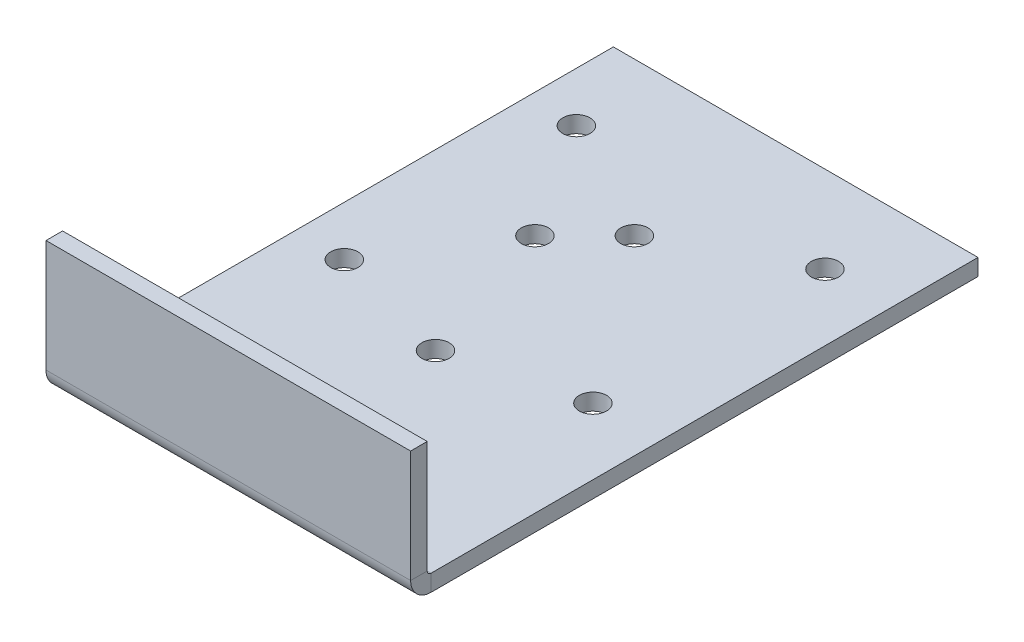
ISO-10303-21;
HEADER;
FILE_DESCRIPTION(('STEP AP214'),'2;1');
FILE_NAME('part.step','',(''),(''),'','','');
FILE_SCHEMA(('AUTOMOTIVE_DESIGN { 1 0 10303 214 1 1 1 1 }'));
ENDSEC;
DATA;
#1=APPLICATION_CONTEXT('core data for automotive mechanical design processes');
#2=APPLICATION_PROTOCOL_DEFINITION('international standard','automotive_design',2000,#1);
#3=PRODUCT_CONTEXT('',#1,'mechanical');
#4=PRODUCT('Part','Part','',(#3));
#5=PRODUCT_RELATED_PRODUCT_CATEGORY('part','',(#4));
#6=PRODUCT_DEFINITION_FORMATION('','',#4);
#7=PRODUCT_DEFINITION_CONTEXT('part definition',#1,'design');
#8=PRODUCT_DEFINITION('design','',#6,#7);
#9=PRODUCT_DEFINITION_SHAPE('','',#8);
#10=(LENGTH_UNIT() NAMED_UNIT(*) SI_UNIT(.MILLI.,.METRE.));
#11=(NAMED_UNIT(*) PLANE_ANGLE_UNIT() SI_UNIT($,.RADIAN.));
#12=(NAMED_UNIT(*) SI_UNIT($,.STERADIAN.) SOLID_ANGLE_UNIT());
#13=UNCERTAINTY_MEASURE_WITH_UNIT(LENGTH_MEASURE(1.E-05),#10,'distance_accuracy_value','');
#14=(GEOMETRIC_REPRESENTATION_CONTEXT(3) GLOBAL_UNCERTAINTY_ASSIGNED_CONTEXT((#13)) GLOBAL_UNIT_ASSIGNED_CONTEXT((#10,
#11,#12)) REPRESENTATION_CONTEXT('',''));
#15=CARTESIAN_POINT('',(0.,0.,0.));
#16=DIRECTION('',(0.,0.,1.));
#17=DIRECTION('',(1.,0.,0.));
#18=AXIS2_PLACEMENT_3D('',#15,#16,#17);
#19=CARTESIAN_POINT('',(0.,-3.175,0.));
#20=DIRECTION('',(-1.,0.,0.));
#21=DIRECTION('',(0.,0.,1.));
#22=AXIS2_PLACEMENT_3D('',#19,#20,#21);
#23=PLANE('',#22);
#24=DIRECTION('',(0.,0.,1.));
#25=VECTOR('',#24,1.);
#26=CARTESIAN_POINT('',(0.,0.,0.));
#27=LINE('',#26,#25);
#28=CARTESIAN_POINT('',(0.,0.,-101.6));
#29=VERTEX_POINT('',#28);
#30=CARTESIAN_POINT('',(0.,0.,3.175));
#31=VERTEX_POINT('',#30);
#32=EDGE_CURVE('E193',#29,#31,#27,.T.);
#33=ORIENTED_EDGE('',*,*,#32,.F.);
#34=DIRECTION('',(0.,1.,0.));
#35=VECTOR('',#34,1.);
#36=CARTESIAN_POINT('',(0.,-3.175,-101.6));
#37=LINE('',#36,#35);
#38=CARTESIAN_POINT('',(0.,-3.175,-101.6));
#39=VERTEX_POINT('',#38);
#40=EDGE_CURVE('E13',#39,#29,#37,.T.);
#41=ORIENTED_EDGE('',*,*,#40,.F.);
#42=DIRECTION('',(0.,0.,1.));
#43=VECTOR('',#42,1.);
#44=CARTESIAN_POINT('',(0.,-3.175,0.));
#45=LINE('',#44,#43);
#46=CARTESIAN_POINT('',(0.,-3.175,3.175));
#47=VERTEX_POINT('',#46);
#48=EDGE_CURVE('E196',#39,#47,#45,.T.);
#49=ORIENTED_EDGE('',*,*,#48,.T.);
#50=DIRECTION('',(0.,-1.,0.));
#51=VECTOR('',#50,1.);
#52=CARTESIAN_POINT('',(0.,0.,3.175));
#53=LINE('',#52,#51);
#54=EDGE_CURVE('E191',#31,#47,#53,.T.);
#55=ORIENTED_EDGE('',*,*,#54,.F.);
#56=EDGE_LOOP('',(#33,#41,#49,#55));
#57=FACE_BOUND('',#56,.T.);
#58=ADVANCED_FACE('F63',(#57),#23,.T.);
#59=CARTESIAN_POINT('',(0.,-3.175,-101.6));
#60=DIRECTION('',(0.,0.,-1.));
#61=DIRECTION('',(-1.,0.,0.));
#62=AXIS2_PLACEMENT_3D('',#59,#60,#61);
#63=PLANE('',#62);
#64=DIRECTION('',(-1.,0.,0.));
#65=VECTOR('',#64,1.);
#66=CARTESIAN_POINT('',(0.,0.,-101.6));
#67=LINE('',#66,#65);
#68=CARTESIAN_POINT('',(69.85,0.,-101.6));
#69=VERTEX_POINT('',#68);
#70=EDGE_CURVE('E199',#69,#29,#67,.T.);
#71=ORIENTED_EDGE('',*,*,#70,.F.);
#72=DIRECTION('',(0.,1.,0.));
#73=VECTOR('',#72,1.);
#74=CARTESIAN_POINT('',(69.85,-3.175,-101.6));
#75=LINE('',#74,#73);
#76=CARTESIAN_POINT('',(69.85,-3.175,-101.6));
#77=VERTEX_POINT('',#76);
#78=EDGE_CURVE('E72',#77,#69,#75,.T.);
#79=ORIENTED_EDGE('',*,*,#78,.F.);
#80=DIRECTION('',(-1.,0.,0.));
#81=VECTOR('',#80,1.);
#82=CARTESIAN_POINT('',(0.,-3.175,-101.6));
#83=LINE('',#82,#81);
#84=EDGE_CURVE('E201',#77,#39,#83,.T.);
#85=ORIENTED_EDGE('',*,*,#84,.T.);
#86=ORIENTED_EDGE('',*,*,#40,.T.);
#87=EDGE_LOOP('',(#71,#79,#85,#86));
#88=FACE_BOUND('',#87,.T.);
#89=ADVANCED_FACE('F276',(#88),#63,.T.);
#90=CARTESIAN_POINT('',(69.85,-3.175,0.));
#91=DIRECTION('',(1.,0.,0.));
#92=DIRECTION('',(0.,0.,-1.));
#93=AXIS2_PLACEMENT_3D('',#90,#91,#92);
#94=PLANE('',#93);
#95=DIRECTION('',(0.,0.,-1.));
#96=VECTOR('',#95,1.);
#97=CARTESIAN_POINT('',(69.85,0.,0.));
#98=LINE('',#97,#96);
#99=CARTESIAN_POINT('',(69.85,0.,3.175));
#100=VERTEX_POINT('',#99);
#101=EDGE_CURVE('E206',#100,#69,#98,.T.);
#102=ORIENTED_EDGE('',*,*,#101,.F.);
#103=DIRECTION('',(0.,-1.,0.));
#104=VECTOR('',#103,1.);
#105=CARTESIAN_POINT('',(69.85,0.,3.175));
#106=LINE('',#105,#104);
#107=CARTESIAN_POINT('',(69.85,-3.175,3.175));
#108=VERTEX_POINT('',#107);
#109=EDGE_CURVE('E180',#100,#108,#106,.T.);
#110=ORIENTED_EDGE('',*,*,#109,.T.);
#111=DIRECTION('',(0.,0.,-1.));
#112=VECTOR('',#111,1.);
#113=CARTESIAN_POINT('',(69.85,-3.175,0.));
#114=LINE('',#113,#112);
#115=EDGE_CURVE('E198',#108,#77,#114,.T.);
#116=ORIENTED_EDGE('',*,*,#115,.T.);
#117=ORIENTED_EDGE('',*,*,#78,.T.);
#118=EDGE_LOOP('',(#102,#110,#116,#117));
#119=FACE_BOUND('',#118,.T.);
#120=ADVANCED_FACE('F281',(#119),#94,.T.);
#121=CARTESIAN_POINT('',(0.,-3.175,0.));
#122=DIRECTION('',(0.,-1.,0.));
#123=DIRECTION('',(0.,0.,-1.));
#124=AXIS2_PLACEMENT_3D('',#121,#122,#123);
#125=PLANE('',#124);
#126=CARTESIAN_POINT('',(33.3375,-3.175,-34.1884));
#127=DIRECTION('',(0.,-1.,0.));
#128=DIRECTION('',(0.,0.,-1.));
#129=AXIS2_PLACEMENT_3D('',#126,#127,#128);
#130=CIRCLE('',#129,2.60985);
#131=CARTESIAN_POINT('',(33.3375,-3.175,-36.79825));
#132=VERTEX_POINT('',#131);
#133=EDGE_CURVE('E238',#132,#132,#130,.T.);
#134=ORIENTED_EDGE('',*,*,#133,.F.);
#135=EDGE_LOOP('',(#134));
#136=FACE_BOUND('',#135,.T.);
#137=CARTESIAN_POINT('',(23.8125,-3.175,-62.7634000000001));
#138=DIRECTION('',(0.,-1.,0.));
#139=DIRECTION('',(0.,0.,-1.));
#140=AXIS2_PLACEMENT_3D('',#137,#138,#139);
#141=CIRCLE('',#140,2.60985);
#142=CARTESIAN_POINT('',(23.8125,-3.175,-65.3732500000001));
#143=VERTEX_POINT('',#142);
#144=EDGE_CURVE('E228',#143,#143,#141,.T.);
#145=ORIENTED_EDGE('',*,*,#144,.F.);
#146=EDGE_LOOP('',(#145));
#147=FACE_BOUND('',#146,.T.);
#148=CARTESIAN_POINT('',(33.3375,-3.175,-72.2884));
#149=DIRECTION('',(0.,-1.,0.));
#150=DIRECTION('',(0.,0.,-1.));
#151=AXIS2_PLACEMENT_3D('',#148,#149,#150);
#152=CIRCLE('',#151,2.60985);
#153=CARTESIAN_POINT('',(33.3375,-3.175,-74.89825));
#154=VERTEX_POINT('',#153);
#155=EDGE_CURVE('E225',#154,#154,#152,.T.);
#156=ORIENTED_EDGE('',*,*,#155,.F.);
#157=EDGE_LOOP('',(#156));
#158=FACE_BOUND('',#157,.T.);
#159=CARTESIAN_POINT('',(57.15,-3.175,-84.9884));
#160=DIRECTION('',(0.,-1.,0.));
#161=DIRECTION('',(0.,0.,-1.));
#162=AXIS2_PLACEMENT_3D('',#159,#160,#161);
#163=CIRCLE('',#162,2.60985);
#164=CARTESIAN_POINT('',(57.15,-3.175,-87.59825));
#165=VERTEX_POINT('',#164);
#166=EDGE_CURVE('E222',#165,#165,#163,.T.);
#167=ORIENTED_EDGE('',*,*,#166,.F.);
#168=EDGE_LOOP('',(#167));
#169=FACE_BOUND('',#168,.T.);
#170=CARTESIAN_POINT('',(57.15,-3.175,-40.5384));
#171=DIRECTION('',(0.,-1.,0.));
#172=DIRECTION('',(0.,0.,-1.));
#173=AXIS2_PLACEMENT_3D('',#170,#171,#172);
#174=CIRCLE('',#173,2.60985);
#175=CARTESIAN_POINT('',(57.15,-3.175,-43.14825));
#176=VERTEX_POINT('',#175);
#177=EDGE_CURVE('E218',#176,#176,#174,.T.);
#178=ORIENTED_EDGE('',*,*,#177,.F.);
#179=EDGE_LOOP('',(#178));
#180=FACE_BOUND('',#179,.T.);
#181=CARTESIAN_POINT('',(9.52499999999999,-3.175,-40.5384000000001));
#182=DIRECTION('',(0.,-1.,0.));
#183=DIRECTION('',(0.,0.,-1.));
#184=AXIS2_PLACEMENT_3D('',#181,#182,#183);
#185=CIRCLE('',#184,2.60985);
#186=CARTESIAN_POINT('',(9.52499999999999,-3.175,-43.1482500000001));
#187=VERTEX_POINT('',#186);
#188=EDGE_CURVE('E217',#187,#187,#185,.T.);
#189=ORIENTED_EDGE('',*,*,#188,.F.);
#190=EDGE_LOOP('',(#189));
#191=FACE_BOUND('',#190,.T.);
#192=CARTESIAN_POINT('',(9.52499999999999,-3.175,-84.9884));
#193=DIRECTION('',(0.,-1.,0.));
#194=DIRECTION('',(0.,0.,-1.));
#195=AXIS2_PLACEMENT_3D('',#192,#193,#194);
#196=CIRCLE('',#195,2.60985);
#197=CARTESIAN_POINT('',(9.52499999999999,-3.175,-87.59825));
#198=VERTEX_POINT('',#197);
#199=EDGE_CURVE('E213',#198,#198,#196,.T.);
#200=ORIENTED_EDGE('',*,*,#199,.F.);
#201=EDGE_LOOP('',(#200));
#202=FACE_BOUND('',#201,.T.);
#203=ORIENTED_EDGE('',*,*,#48,.F.);
#204=ORIENTED_EDGE('',*,*,#84,.F.);
#205=ORIENTED_EDGE('',*,*,#115,.F.);
#206=DIRECTION('',(1.,0.,0.));
#207=VECTOR('',#206,1.);
#208=CARTESIAN_POINT('',(69.85,-3.175,3.175));
#209=LINE('',#208,#207);
#210=EDGE_CURVE('E175',#108,#47,#209,.F.);
#211=ORIENTED_EDGE('',*,*,#210,.T.);
#212=EDGE_LOOP('',(#203,#204,#205,#211));
#213=FACE_BOUND('',#212,.T.);
#214=ADVANCED_FACE('F292',(#136,#147,#158,#169,#180,#191,#202,#213),#125,.T.);
#215=CARTESIAN_POINT('',(0.,0.,0.));
#216=DIRECTION('',(0.,-1.,0.));
#217=DIRECTION('',(0.,0.,-1.));
#218=AXIS2_PLACEMENT_3D('',#215,#216,#217);
#219=PLANE('',#218);
#220=CARTESIAN_POINT('',(33.3375,0.,-34.1884));
#221=DIRECTION('',(0.,-1.,0.));
#222=DIRECTION('',(0.,0.,-1.));
#223=AXIS2_PLACEMENT_3D('',#220,#221,#222);
#224=CIRCLE('',#223,2.60985);
#225=CARTESIAN_POINT('',(33.3375,0.,-36.79825));
#226=VERTEX_POINT('',#225);
#227=EDGE_CURVE('E66',#226,#226,#224,.T.);
#228=ORIENTED_EDGE('',*,*,#227,.T.);
#229=EDGE_LOOP('',(#228));
#230=FACE_BOUND('',#229,.T.);
#231=CARTESIAN_POINT('',(23.8125,0.,-62.7634000000001));
#232=DIRECTION('',(0.,-1.,0.));
#233=DIRECTION('',(0.,0.,-1.));
#234=AXIS2_PLACEMENT_3D('',#231,#232,#233);
#235=CIRCLE('',#234,2.60985);
#236=CARTESIAN_POINT('',(23.8125,0.,-65.3732500000001));
#237=VERTEX_POINT('',#236);
#238=EDGE_CURVE('E226',#237,#237,#235,.T.);
#239=ORIENTED_EDGE('',*,*,#238,.T.);
#240=EDGE_LOOP('',(#239));
#241=FACE_BOUND('',#240,.T.);
#242=CARTESIAN_POINT('',(33.3375,0.,-72.2884));
#243=DIRECTION('',(0.,-1.,0.));
#244=DIRECTION('',(0.,0.,-1.));
#245=AXIS2_PLACEMENT_3D('',#242,#243,#244);
#246=CIRCLE('',#245,2.60985);
#247=CARTESIAN_POINT('',(33.3375,0.,-74.89825));
#248=VERTEX_POINT('',#247);
#249=EDGE_CURVE('E223',#248,#248,#246,.T.);
#250=ORIENTED_EDGE('',*,*,#249,.T.);
#251=EDGE_LOOP('',(#250));
#252=FACE_BOUND('',#251,.T.);
#253=CARTESIAN_POINT('',(57.15,0.,-84.9884));
#254=DIRECTION('',(0.,-1.,0.));
#255=DIRECTION('',(0.,0.,-1.));
#256=AXIS2_PLACEMENT_3D('',#253,#254,#255);
#257=CIRCLE('',#256,2.60985);
#258=CARTESIAN_POINT('',(57.15,0.,-87.59825));
#259=VERTEX_POINT('',#258);
#260=EDGE_CURVE('E219',#259,#259,#257,.T.);
#261=ORIENTED_EDGE('',*,*,#260,.T.);
#262=EDGE_LOOP('',(#261));
#263=FACE_BOUND('',#262,.T.);
#264=CARTESIAN_POINT('',(57.15,0.,-40.5384));
#265=DIRECTION('',(0.,-1.,0.));
#266=DIRECTION('',(0.,0.,-1.));
#267=AXIS2_PLACEMENT_3D('',#264,#265,#266);
#268=CIRCLE('',#267,2.60985);
#269=CARTESIAN_POINT('',(57.15,0.,-43.14825));
#270=VERTEX_POINT('',#269);
#271=EDGE_CURVE('E214',#270,#270,#268,.T.);
#272=ORIENTED_EDGE('',*,*,#271,.T.);
#273=EDGE_LOOP('',(#272));
#274=FACE_BOUND('',#273,.T.);
#275=CARTESIAN_POINT('',(9.52499999999999,0.,-40.5384000000001));
#276=DIRECTION('',(0.,-1.,0.));
#277=DIRECTION('',(0.,0.,-1.));
#278=AXIS2_PLACEMENT_3D('',#275,#276,#277);
#279=CIRCLE('',#278,2.60985);
#280=CARTESIAN_POINT('',(9.52499999999999,0.,-43.1482500000001));
#281=VERTEX_POINT('',#280);
#282=EDGE_CURVE('E247',#281,#281,#279,.T.);
#283=ORIENTED_EDGE('',*,*,#282,.T.);
#284=EDGE_LOOP('',(#283));
#285=FACE_BOUND('',#284,.T.);
#286=CARTESIAN_POINT('',(9.52499999999999,0.,-84.9884));
#287=DIRECTION('',(0.,-1.,0.));
#288=DIRECTION('',(0.,0.,-1.));
#289=AXIS2_PLACEMENT_3D('',#286,#287,#288);
#290=CIRCLE('',#289,2.60985);
#291=CARTESIAN_POINT('',(9.52499999999999,0.,-87.59825));
#292=VERTEX_POINT('',#291);
#293=EDGE_CURVE('E174',#292,#292,#290,.T.);
#294=ORIENTED_EDGE('',*,*,#293,.T.);
#295=EDGE_LOOP('',(#294));
#296=FACE_BOUND('',#295,.T.);
#297=ORIENTED_EDGE('',*,*,#32,.T.);
#298=DIRECTION('',(1.,0.,0.));
#299=VECTOR('',#298,1.);
#300=CARTESIAN_POINT('',(69.85,0.,3.175));
#301=LINE('',#300,#299);
#302=EDGE_CURVE('E186',#100,#31,#301,.F.);
#303=ORIENTED_EDGE('',*,*,#302,.F.);
#304=ORIENTED_EDGE('',*,*,#101,.T.);
#305=ORIENTED_EDGE('',*,*,#70,.T.);
#306=EDGE_LOOP('',(#297,#303,#304,#305));
#307=FACE_BOUND('',#306,.T.);
#308=ADVANCED_FACE('F288',(#230,#241,#252,#263,#274,#285,#296,#307),#219,.F.);
#309=CARTESIAN_POINT('',(0.,0.736599999999997,3.175));
#310=DIRECTION('',(-1.,0.,0.));
#311=DIRECTION('',(0.,0.,1.));
#312=AXIS2_PLACEMENT_3D('',#309,#310,#311);
#313=PLANE('',#312);
#314=DIRECTION('',(0.,0.,-1.));
#315=VECTOR('',#314,1.);
#316=CARTESIAN_POINT('',(0.,0.736599999999997,7.0866));
#317=LINE('',#316,#315);
#318=CARTESIAN_POINT('',(0.,0.736599999999997,3.9116));
#319=VERTEX_POINT('',#318);
#320=CARTESIAN_POINT('',(0.,0.736599999999997,7.0866));
#321=VERTEX_POINT('',#320);
#322=EDGE_CURVE('E156',#319,#321,#317,.F.);
#323=ORIENTED_EDGE('',*,*,#322,.F.);
#324=CARTESIAN_POINT('',(0.,0.736599999999997,3.175));
#325=DIRECTION('',(1.,0.,0.));
#326=DIRECTION('',(0.,0.,-1.));
#327=AXIS2_PLACEMENT_3D('',#324,#325,#326);
#328=CIRCLE('',#327,0.7366);
#329=EDGE_CURVE('E183',#31,#319,#328,.F.);
#330=ORIENTED_EDGE('',*,*,#329,.F.);
#331=ORIENTED_EDGE('',*,*,#54,.T.);
#332=CARTESIAN_POINT('',(0.,0.736599999999997,3.175));
#333=DIRECTION('',(1.,0.,0.));
#334=DIRECTION('',(0.,0.,-1.));
#335=AXIS2_PLACEMENT_3D('',#332,#333,#334);
#336=CIRCLE('',#335,3.9116);
#337=EDGE_CURVE('E97',#47,#321,#336,.F.);
#338=ORIENTED_EDGE('',*,*,#337,.T.);
#339=EDGE_LOOP('',(#323,#330,#331,#338));
#340=FACE_BOUND('',#339,.T.);
#341=ADVANCED_FACE('F294',(#340),#313,.T.);
#342=CARTESIAN_POINT('',(69.85,0.736599999999997,3.175));
#343=DIRECTION('',(-1.,0.,0.));
#344=DIRECTION('',(0.,0.,1.));
#345=AXIS2_PLACEMENT_3D('',#342,#343,#344);
#346=PLANE('',#345);
#347=CARTESIAN_POINT('',(69.85,0.736599999999997,3.175));
#348=DIRECTION('',(1.,0.,0.));
#349=DIRECTION('',(0.,0.,-1.));
#350=AXIS2_PLACEMENT_3D('',#347,#348,#349);
#351=CIRCLE('',#350,0.7366);
#352=CARTESIAN_POINT('',(69.85,0.736599999999997,3.9116));
#353=VERTEX_POINT('',#352);
#354=EDGE_CURVE('E188',#353,#100,#351,.T.);
#355=ORIENTED_EDGE('',*,*,#354,.F.);
#356=DIRECTION('',(0.,0.,-1.));
#357=VECTOR('',#356,1.);
#358=CARTESIAN_POINT('',(69.85,0.736599999999997,3.9116));
#359=LINE('',#358,#357);
#360=CARTESIAN_POINT('',(69.85,0.736599999999997,7.0866));
#361=VERTEX_POINT('',#360);
#362=EDGE_CURVE('E168',#353,#361,#359,.F.);
#363=ORIENTED_EDGE('',*,*,#362,.T.);
#364=CARTESIAN_POINT('',(69.85,0.736599999999997,3.175));
#365=DIRECTION('',(1.,0.,0.));
#366=DIRECTION('',(0.,0.,-1.));
#367=AXIS2_PLACEMENT_3D('',#364,#365,#366);
#368=CIRCLE('',#367,3.9116);
#369=EDGE_CURVE('E178',#361,#108,#368,.T.);
#370=ORIENTED_EDGE('',*,*,#369,.T.);
#371=ORIENTED_EDGE('',*,*,#109,.F.);
#372=EDGE_LOOP('',(#355,#363,#370,#371));
#373=FACE_BOUND('',#372,.T.);
#374=ADVANCED_FACE('F262',(#373),#346,.F.);
#375=CARTESIAN_POINT('',(69.85,0.736599999999997,3.175));
#376=DIRECTION('',(1.,0.,0.));
#377=DIRECTION('',(0.,0.,1.));
#378=AXIS2_PLACEMENT_3D('',#375,#376,#377);
#379=CYLINDRICAL_SURFACE('',#378,3.9116);
#380=ORIENTED_EDGE('',*,*,#210,.F.);
#381=ORIENTED_EDGE('',*,*,#369,.F.);
#382=DIRECTION('',(1.,0.,0.));
#383=VECTOR('',#382,1.);
#384=CARTESIAN_POINT('',(0.,0.736599999999997,7.0866));
#385=LINE('',#384,#383);
#386=EDGE_CURVE('E166',#361,#321,#385,.F.);
#387=ORIENTED_EDGE('',*,*,#386,.T.);
#388=ORIENTED_EDGE('',*,*,#337,.F.);
#389=EDGE_LOOP('',(#380,#381,#387,#388));
#390=FACE_BOUND('',#389,.T.);
#391=ADVANCED_FACE('F271',(#390),#379,.T.);
#392=CARTESIAN_POINT('',(69.85,0.736599999999997,3.175));
#393=DIRECTION('',(1.,0.,0.));
#394=DIRECTION('',(0.,0.,1.));
#395=AXIS2_PLACEMENT_3D('',#392,#393,#394);
#396=CYLINDRICAL_SURFACE('',#395,0.7366);
#397=ORIENTED_EDGE('',*,*,#302,.T.);
#398=ORIENTED_EDGE('',*,*,#329,.T.);
#399=DIRECTION('',(1.,0.,0.));
#400=VECTOR('',#399,1.);
#401=CARTESIAN_POINT('',(0.,0.736599999999997,3.9116));
#402=LINE('',#401,#400);
#403=EDGE_CURVE('E171',#319,#353,#402,.T.);
#404=ORIENTED_EDGE('',*,*,#403,.T.);
#405=ORIENTED_EDGE('',*,*,#354,.T.);
#406=EDGE_LOOP('',(#397,#398,#404,#405));
#407=FACE_BOUND('',#406,.T.);
#408=ADVANCED_FACE('F258',(#407),#396,.F.);
#409=CARTESIAN_POINT('',(69.85,22.225,7.0866));
#410=DIRECTION('',(-1.,0.,0.));
#411=DIRECTION('',(0.,0.,1.));
#412=AXIS2_PLACEMENT_3D('',#409,#410,#411);
#413=PLANE('',#412);
#414=ORIENTED_EDGE('',*,*,#362,.F.);
#415=DIRECTION('',(0.,-1.,0.));
#416=VECTOR('',#415,1.);
#417=CARTESIAN_POINT('',(69.85,22.225,3.9116));
#418=LINE('',#417,#416);
#419=CARTESIAN_POINT('',(69.85,22.225,3.9116));
#420=VERTEX_POINT('',#419);
#421=EDGE_CURVE('E164',#353,#420,#418,.F.);
#422=ORIENTED_EDGE('',*,*,#421,.T.);
#423=DIRECTION('',(0.,0.,-1.));
#424=VECTOR('',#423,1.);
#425=CARTESIAN_POINT('',(69.85,22.225,7.0866));
#426=LINE('',#425,#424);
#427=CARTESIAN_POINT('',(69.85,22.225,7.0866));
#428=VERTEX_POINT('',#427);
#429=EDGE_CURVE('E152',#428,#420,#426,.T.);
#430=ORIENTED_EDGE('',*,*,#429,.F.);
#431=DIRECTION('',(0.,1.,0.));
#432=VECTOR('',#431,1.);
#433=CARTESIAN_POINT('',(69.85,0.,7.0866));
#434=LINE('',#433,#432);
#435=EDGE_CURVE('E139',#361,#428,#434,.T.);
#436=ORIENTED_EDGE('',*,*,#435,.F.);
#437=EDGE_LOOP('',(#414,#422,#430,#436));
#438=FACE_BOUND('',#437,.T.);
#439=ADVANCED_FACE('F263',(#438),#413,.F.);
#440=CARTESIAN_POINT('',(0.,0.,7.0866));
#441=DIRECTION('',(1.,0.,0.));
#442=DIRECTION('',(0.,0.,-1.));
#443=AXIS2_PLACEMENT_3D('',#440,#441,#442);
#444=PLANE('',#443);
#445=ORIENTED_EDGE('',*,*,#322,.T.);
#446=DIRECTION('',(0.,-1.,0.));
#447=VECTOR('',#446,1.);
#448=CARTESIAN_POINT('',(0.,0.,7.0866));
#449=LINE('',#448,#447);
#450=CARTESIAN_POINT('',(0.,22.225,7.0866));
#451=VERTEX_POINT('',#450);
#452=EDGE_CURVE('E137',#451,#321,#449,.T.);
#453=ORIENTED_EDGE('',*,*,#452,.F.);
#454=DIRECTION('',(0.,0.,-1.));
#455=VECTOR('',#454,1.);
#456=CARTESIAN_POINT('',(0.,22.225,7.0866));
#457=LINE('',#456,#455);
#458=CARTESIAN_POINT('',(0.,22.225,3.9116));
#459=VERTEX_POINT('',#458);
#460=EDGE_CURVE('E145',#451,#459,#457,.T.);
#461=ORIENTED_EDGE('',*,*,#460,.T.);
#462=DIRECTION('',(0.,1.,0.));
#463=VECTOR('',#462,1.);
#464=CARTESIAN_POINT('',(0.,0.,3.9116));
#465=LINE('',#464,#463);
#466=EDGE_CURVE('E161',#459,#319,#465,.F.);
#467=ORIENTED_EDGE('',*,*,#466,.T.);
#468=EDGE_LOOP('',(#445,#453,#461,#467));
#469=FACE_BOUND('',#468,.T.);
#470=ADVANCED_FACE('F155',(#469),#444,.F.);
#471=CARTESIAN_POINT('',(0.,0.,7.0866));
#472=DIRECTION('',(0.,0.,-1.));
#473=DIRECTION('',(-1.,0.,0.));
#474=AXIS2_PLACEMENT_3D('',#471,#472,#473);
#475=PLANE('',#474);
#476=ORIENTED_EDGE('',*,*,#386,.F.);
#477=ORIENTED_EDGE('',*,*,#435,.T.);
#478=DIRECTION('',(-1.,0.,0.));
#479=VECTOR('',#478,1.);
#480=CARTESIAN_POINT('',(0.,22.225,7.0866));
#481=LINE('',#480,#479);
#482=EDGE_CURVE('E132',#428,#451,#481,.T.);
#483=ORIENTED_EDGE('',*,*,#482,.T.);
#484=ORIENTED_EDGE('',*,*,#452,.T.);
#485=EDGE_LOOP('',(#476,#477,#483,#484));
#486=FACE_BOUND('',#485,.T.);
#487=ADVANCED_FACE('F135',(#486),#475,.F.);
#488=CARTESIAN_POINT('',(0.,0.,3.9116));
#489=DIRECTION('',(0.,0.,-1.));
#490=DIRECTION('',(-1.,0.,0.));
#491=AXIS2_PLACEMENT_3D('',#488,#489,#490);
#492=PLANE('',#491);
#493=ORIENTED_EDGE('',*,*,#421,.F.);
#494=ORIENTED_EDGE('',*,*,#403,.F.);
#495=ORIENTED_EDGE('',*,*,#466,.F.);
#496=DIRECTION('',(1.,0.,0.));
#497=VECTOR('',#496,1.);
#498=CARTESIAN_POINT('',(0.,22.225,3.9116));
#499=LINE('',#498,#497);
#500=EDGE_CURVE('E148',#420,#459,#499,.F.);
#501=ORIENTED_EDGE('',*,*,#500,.F.);
#502=EDGE_LOOP('',(#493,#494,#495,#501));
#503=FACE_BOUND('',#502,.T.);
#504=ADVANCED_FACE('F254',(#503),#492,.T.);
#505=CARTESIAN_POINT('',(0.,22.225,7.0866));
#506=DIRECTION('',(0.,-1.,0.));
#507=DIRECTION('',(0.,0.,-1.));
#508=AXIS2_PLACEMENT_3D('',#505,#506,#507);
#509=PLANE('',#508);
#510=ORIENTED_EDGE('',*,*,#500,.T.);
#511=ORIENTED_EDGE('',*,*,#460,.F.);
#512=ORIENTED_EDGE('',*,*,#482,.F.);
#513=ORIENTED_EDGE('',*,*,#429,.T.);
#514=EDGE_LOOP('',(#510,#511,#512,#513));
#515=FACE_BOUND('',#514,.T.);
#516=ADVANCED_FACE('F146',(#515),#509,.F.);
#517=CARTESIAN_POINT('',(9.52499999999999,-3.175,-84.9884));
#518=DIRECTION('',(0.,-1.,0.));
#519=DIRECTION('',(0.,0.,-1.));
#520=AXIS2_PLACEMENT_3D('',#517,#518,#519);
#521=CYLINDRICAL_SURFACE('',#520,2.60985);
#522=ORIENTED_EDGE('',*,*,#199,.T.);
#523=EDGE_LOOP('',(#522));
#524=FACE_BOUND('',#523,.T.);
#525=ORIENTED_EDGE('',*,*,#293,.F.);
#526=EDGE_LOOP('',(#525));
#527=FACE_BOUND('',#526,.T.);
#528=ADVANCED_FACE('F385',(#524,#527),#521,.F.);
#529=CARTESIAN_POINT('',(9.52499999999999,-3.175,-40.5384000000001));
#530=DIRECTION('',(0.,-1.,0.));
#531=DIRECTION('',(0.,0.,-1.));
#532=AXIS2_PLACEMENT_3D('',#529,#530,#531);
#533=CYLINDRICAL_SURFACE('',#532,2.60985);
#534=ORIENTED_EDGE('',*,*,#188,.T.);
#535=EDGE_LOOP('',(#534));
#536=FACE_BOUND('',#535,.T.);
#537=ORIENTED_EDGE('',*,*,#282,.F.);
#538=EDGE_LOOP('',(#537));
#539=FACE_BOUND('',#538,.T.);
#540=ADVANCED_FACE('F394',(#536,#539),#533,.F.);
#541=CARTESIAN_POINT('',(57.15,-3.175,-40.5384));
#542=DIRECTION('',(0.,-1.,0.));
#543=DIRECTION('',(0.,0.,-1.));
#544=AXIS2_PLACEMENT_3D('',#541,#542,#543);
#545=CYLINDRICAL_SURFACE('',#544,2.60985);
#546=ORIENTED_EDGE('',*,*,#177,.T.);
#547=EDGE_LOOP('',(#546));
#548=FACE_BOUND('',#547,.T.);
#549=ORIENTED_EDGE('',*,*,#271,.F.);
#550=EDGE_LOOP('',(#549));
#551=FACE_BOUND('',#550,.T.);
#552=ADVANCED_FACE('F404',(#548,#551),#545,.F.);
#553=CARTESIAN_POINT('',(57.15,-3.175,-84.9884));
#554=DIRECTION('',(0.,-1.,0.));
#555=DIRECTION('',(0.,0.,-1.));
#556=AXIS2_PLACEMENT_3D('',#553,#554,#555);
#557=CYLINDRICAL_SURFACE('',#556,2.60985);
#558=ORIENTED_EDGE('',*,*,#166,.T.);
#559=EDGE_LOOP('',(#558));
#560=FACE_BOUND('',#559,.T.);
#561=ORIENTED_EDGE('',*,*,#260,.F.);
#562=EDGE_LOOP('',(#561));
#563=FACE_BOUND('',#562,.T.);
#564=ADVANCED_FACE('F414',(#560,#563),#557,.F.);
#565=CARTESIAN_POINT('',(33.3375,-3.175,-72.2884));
#566=DIRECTION('',(0.,-1.,0.));
#567=DIRECTION('',(0.,0.,-1.));
#568=AXIS2_PLACEMENT_3D('',#565,#566,#567);
#569=CYLINDRICAL_SURFACE('',#568,2.60985);
#570=ORIENTED_EDGE('',*,*,#155,.T.);
#571=EDGE_LOOP('',(#570));
#572=FACE_BOUND('',#571,.T.);
#573=ORIENTED_EDGE('',*,*,#249,.F.);
#574=EDGE_LOOP('',(#573));
#575=FACE_BOUND('',#574,.T.);
#576=ADVANCED_FACE('F424',(#572,#575),#569,.F.);
#577=CARTESIAN_POINT('',(23.8125,-3.175,-62.7634000000001));
#578=DIRECTION('',(0.,-1.,0.));
#579=DIRECTION('',(0.,0.,-1.));
#580=AXIS2_PLACEMENT_3D('',#577,#578,#579);
#581=CYLINDRICAL_SURFACE('',#580,2.60985);
#582=ORIENTED_EDGE('',*,*,#144,.T.);
#583=EDGE_LOOP('',(#582));
#584=FACE_BOUND('',#583,.T.);
#585=ORIENTED_EDGE('',*,*,#238,.F.);
#586=EDGE_LOOP('',(#585));
#587=FACE_BOUND('',#586,.T.);
#588=ADVANCED_FACE('F434',(#584,#587),#581,.F.);
#589=CARTESIAN_POINT('',(33.3375,-3.175,-34.1884));
#590=DIRECTION('',(0.,-1.,0.));
#591=DIRECTION('',(0.,0.,-1.));
#592=AXIS2_PLACEMENT_3D('',#589,#590,#591);
#593=CYLINDRICAL_SURFACE('',#592,2.60985);
#594=ORIENTED_EDGE('',*,*,#133,.T.);
#595=EDGE_LOOP('',(#594));
#596=FACE_BOUND('',#595,.T.);
#597=ORIENTED_EDGE('',*,*,#227,.F.);
#598=EDGE_LOOP('',(#597));
#599=FACE_BOUND('',#598,.T.);
#600=ADVANCED_FACE('F444',(#596,#599),#593,.F.);
#601=CLOSED_SHELL('',(#58,#89,#120,#214,#308,#341,#374,#391,#408,#439,#470,#487,#504,#516,#528,
#540,#552,#564,#576,#588,#600));
#602=MANIFOLD_SOLID_BREP('B2',#601);
#603=ADVANCED_BREP_SHAPE_REPRESENTATION('',(#18,#602),#14);
#604=SHAPE_DEFINITION_REPRESENTATION(#9,#603);
ENDSEC;
END-ISO-10303-21;
